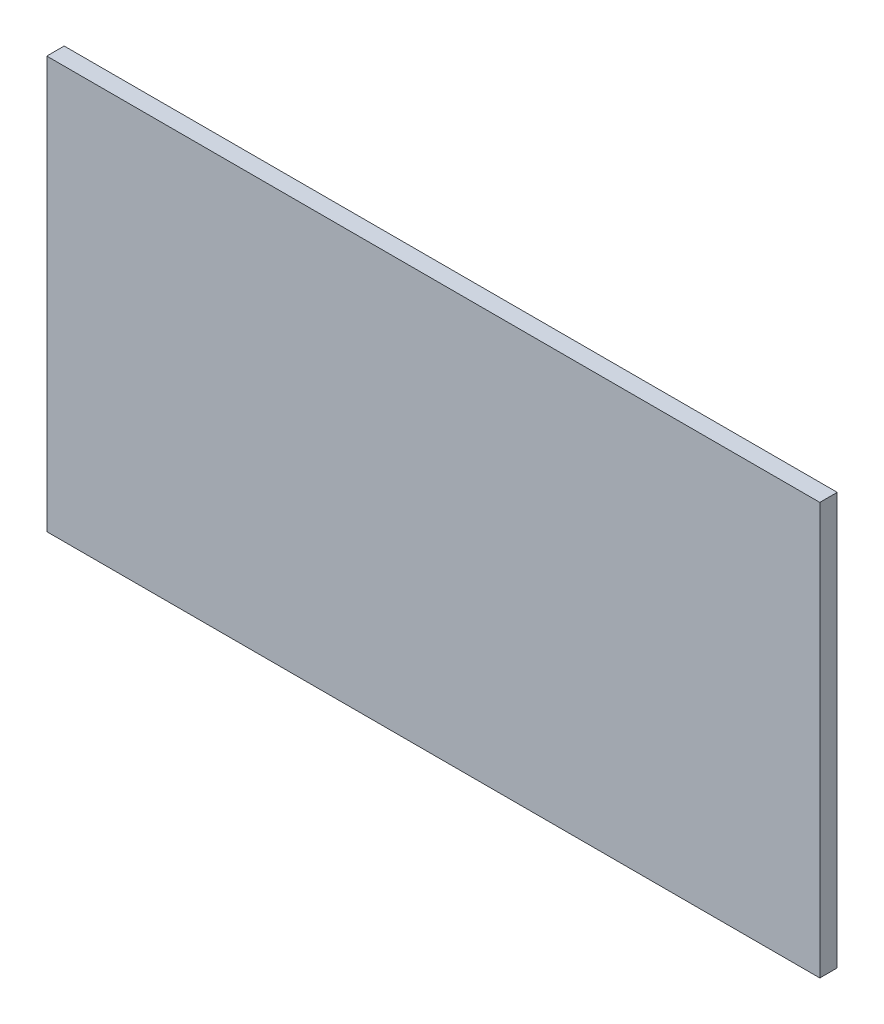
ISO-10303-21;
HEADER;
FILE_DESCRIPTION(('STEP AP214'),'2;1');
FILE_NAME('part.step','',(''),(''),'','','');
FILE_SCHEMA(('AUTOMOTIVE_DESIGN { 1 0 10303 214 1 1 1 1 }'));
ENDSEC;
DATA;
#1=APPLICATION_CONTEXT('core data for automotive mechanical design processes');
#2=APPLICATION_PROTOCOL_DEFINITION('international standard','automotive_design',2000,#1);
#3=PRODUCT_CONTEXT('',#1,'mechanical');
#4=PRODUCT('Part','Part','',(#3));
#5=PRODUCT_RELATED_PRODUCT_CATEGORY('part','',(#4));
#6=PRODUCT_DEFINITION_FORMATION('','',#4);
#7=PRODUCT_DEFINITION_CONTEXT('part definition',#1,'design');
#8=PRODUCT_DEFINITION('design','',#6,#7);
#9=PRODUCT_DEFINITION_SHAPE('','',#8);
#10=(LENGTH_UNIT() NAMED_UNIT(*) SI_UNIT(.MILLI.,.METRE.));
#11=(NAMED_UNIT(*) PLANE_ANGLE_UNIT() SI_UNIT($,.RADIAN.));
#12=(NAMED_UNIT(*) SI_UNIT($,.STERADIAN.) SOLID_ANGLE_UNIT());
#13=UNCERTAINTY_MEASURE_WITH_UNIT(LENGTH_MEASURE(1.E-05),#10,'distance_accuracy_value','');
#14=(GEOMETRIC_REPRESENTATION_CONTEXT(3) GLOBAL_UNCERTAINTY_ASSIGNED_CONTEXT((#13)) GLOBAL_UNIT_ASSIGNED_CONTEXT((#10,
#11,#12)) REPRESENTATION_CONTEXT('',''));
#15=CARTESIAN_POINT('',(0.,0.,0.));
#16=DIRECTION('',(0.,0.,1.));
#17=DIRECTION('',(1.,0.,0.));
#18=AXIS2_PLACEMENT_3D('',#15,#16,#17);
#19=CARTESIAN_POINT('',(-57.8962890430608,16.3830794366839,1.));
#20=DIRECTION('',(1.,0.,0.));
#21=DIRECTION('',(0.,1.,0.));
#22=AXIS2_PLACEMENT_3D('',#19,#20,#21);
#23=PLANE('',#22);
#24=DIRECTION('',(0.,-1.,0.));
#25=VECTOR('',#24,1.);
#26=CARTESIAN_POINT('',(-57.8962890430608,16.3830794366839,0.));
#27=LINE('',#26,#25);
#28=CARTESIAN_POINT('',(-57.8962890430608,16.3830794366839,0.));
#29=VERTEX_POINT('',#28);
#30=CARTESIAN_POINT('',(-57.8962890430608,-7.27124352331605,0.));
#31=VERTEX_POINT('',#30);
#32=EDGE_CURVE('E96',#29,#31,#27,.T.);
#33=ORIENTED_EDGE('',*,*,#32,.T.);
#34=DIRECTION('',(0.,0.,-1.));
#35=VECTOR('',#34,1.);
#36=CARTESIAN_POINT('',(-57.8962890430608,-7.27124352331605,1.));
#37=LINE('',#36,#35);
#38=CARTESIAN_POINT('',(-57.8962890430608,-7.27124352331605,1.));
#39=VERTEX_POINT('',#38);
#40=EDGE_CURVE('E11',#39,#31,#37,.T.);
#41=ORIENTED_EDGE('',*,*,#40,.F.);
#42=DIRECTION('',(0.,-1.,0.));
#43=VECTOR('',#42,1.);
#44=CARTESIAN_POINT('',(-57.8962890430608,16.3830794366839,1.));
#45=LINE('',#44,#43);
#46=CARTESIAN_POINT('',(-57.8962890430608,16.3830794366839,1.));
#47=VERTEX_POINT('',#46);
#48=EDGE_CURVE('E84',#47,#39,#45,.T.);
#49=ORIENTED_EDGE('',*,*,#48,.F.);
#50=DIRECTION('',(0.,0.,-1.));
#51=VECTOR('',#50,1.);
#52=CARTESIAN_POINT('',(-57.8962890430608,16.3830794366839,1.));
#53=LINE('',#52,#51);
#54=EDGE_CURVE('E92',#47,#29,#53,.T.);
#55=ORIENTED_EDGE('',*,*,#54,.T.);
#56=EDGE_LOOP('',(#33,#41,#49,#55));
#57=FACE_BOUND('',#56,.T.);
#58=ADVANCED_FACE('F33',(#57),#23,.F.);
#59=CARTESIAN_POINT('',(-57.8962890430608,-7.27124352331605,1.));
#60=DIRECTION('',(0.,1.,0.));
#61=DIRECTION('',(0.,0.,1.));
#62=AXIS2_PLACEMENT_3D('',#59,#60,#61);
#63=PLANE('',#62);
#64=DIRECTION('',(1.,0.,0.));
#65=VECTOR('',#64,1.);
#66=CARTESIAN_POINT('',(-57.8962890430608,-7.27124352331605,0.));
#67=LINE('',#66,#65);
#68=CARTESIAN_POINT('',(-13.5012238530608,-7.27124352331605,0.));
#69=VERTEX_POINT('',#68);
#70=EDGE_CURVE('E88',#31,#69,#67,.T.);
#71=ORIENTED_EDGE('',*,*,#70,.T.);
#72=DIRECTION('',(0.,0.,-1.));
#73=VECTOR('',#72,1.);
#74=CARTESIAN_POINT('',(-13.5012238530608,-7.27124352331605,1.));
#75=LINE('',#74,#73);
#76=CARTESIAN_POINT('',(-13.5012238530608,-7.27124352331605,1.));
#77=VERTEX_POINT('',#76);
#78=EDGE_CURVE('E41',#77,#69,#75,.T.);
#79=ORIENTED_EDGE('',*,*,#78,.F.);
#80=DIRECTION('',(1.,0.,0.));
#81=VECTOR('',#80,1.);
#82=CARTESIAN_POINT('',(-57.8962890430608,-7.27124352331605,1.));
#83=LINE('',#82,#81);
#84=EDGE_CURVE('E79',#39,#77,#83,.T.);
#85=ORIENTED_EDGE('',*,*,#84,.F.);
#86=ORIENTED_EDGE('',*,*,#40,.T.);
#87=EDGE_LOOP('',(#71,#79,#85,#86));
#88=FACE_BOUND('',#87,.T.);
#89=ADVANCED_FACE('F87',(#88),#63,.F.);
#90=CARTESIAN_POINT('',(-13.5012238530608,16.3830794366839,1.));
#91=DIRECTION('',(-1.,0.,0.));
#92=DIRECTION('',(0.,-1.,0.));
#93=AXIS2_PLACEMENT_3D('',#90,#91,#92);
#94=PLANE('',#93);
#95=DIRECTION('',(0.,1.,0.));
#96=VECTOR('',#95,1.);
#97=CARTESIAN_POINT('',(-13.5012238530608,16.3830794366839,0.));
#98=LINE('',#97,#96);
#99=CARTESIAN_POINT('',(-13.5012238530608,16.3830794366839,0.));
#100=VERTEX_POINT('',#99);
#101=EDGE_CURVE('E66',#69,#100,#98,.T.);
#102=ORIENTED_EDGE('',*,*,#101,.T.);
#103=DIRECTION('',(0.,0.,-1.));
#104=VECTOR('',#103,1.);
#105=CARTESIAN_POINT('',(-13.5012238530608,16.3830794366839,1.));
#106=LINE('',#105,#104);
#107=CARTESIAN_POINT('',(-13.5012238530608,16.3830794366839,1.));
#108=VERTEX_POINT('',#107);
#109=EDGE_CURVE('E89',#108,#100,#106,.T.);
#110=ORIENTED_EDGE('',*,*,#109,.F.);
#111=DIRECTION('',(0.,1.,0.));
#112=VECTOR('',#111,1.);
#113=CARTESIAN_POINT('',(-13.5012238530608,16.3830794366839,1.));
#114=LINE('',#113,#112);
#115=EDGE_CURVE('E82',#77,#108,#114,.T.);
#116=ORIENTED_EDGE('',*,*,#115,.F.);
#117=ORIENTED_EDGE('',*,*,#78,.T.);
#118=EDGE_LOOP('',(#102,#110,#116,#117));
#119=FACE_BOUND('',#118,.T.);
#120=ADVANCED_FACE('F90',(#119),#94,.F.);
#121=CARTESIAN_POINT('',(-57.8962890430608,16.3830794366839,1.));
#122=DIRECTION('',(0.,-1.,0.));
#123=DIRECTION('',(0.,0.,-1.));
#124=AXIS2_PLACEMENT_3D('',#121,#122,#123);
#125=PLANE('',#124);
#126=DIRECTION('',(-1.,0.,0.));
#127=VECTOR('',#126,1.);
#128=CARTESIAN_POINT('',(-57.8962890430608,16.3830794366839,0.));
#129=LINE('',#128,#127);
#130=EDGE_CURVE('E72',#100,#29,#129,.T.);
#131=ORIENTED_EDGE('',*,*,#130,.T.);
#132=ORIENTED_EDGE('',*,*,#54,.F.);
#133=DIRECTION('',(-1.,0.,0.));
#134=VECTOR('',#133,1.);
#135=CARTESIAN_POINT('',(-57.8962890430608,16.3830794366839,1.));
#136=LINE('',#135,#134);
#137=EDGE_CURVE('E49',#108,#47,#136,.T.);
#138=ORIENTED_EDGE('',*,*,#137,.F.);
#139=ORIENTED_EDGE('',*,*,#109,.T.);
#140=EDGE_LOOP('',(#131,#132,#138,#139));
#141=FACE_BOUND('',#140,.T.);
#142=ADVANCED_FACE('F103',(#141),#125,.F.);
#143=CARTESIAN_POINT('',(0.,0.,1.));
#144=DIRECTION('',(0.,0.,1.));
#145=DIRECTION('',(1.,0.,0.));
#146=AXIS2_PLACEMENT_3D('',#143,#144,#145);
#147=PLANE('',#146);
#148=ORIENTED_EDGE('',*,*,#48,.T.);
#149=ORIENTED_EDGE('',*,*,#84,.T.);
#150=ORIENTED_EDGE('',*,*,#115,.T.);
#151=ORIENTED_EDGE('',*,*,#137,.T.);
#152=EDGE_LOOP('',(#148,#149,#150,#151));
#153=FACE_BOUND('',#152,.T.);
#154=ADVANCED_FACE('F80',(#153),#147,.T.);
#155=CARTESIAN_POINT('',(0.,0.,0.));
#156=DIRECTION('',(0.,0.,1.));
#157=DIRECTION('',(1.,0.,0.));
#158=AXIS2_PLACEMENT_3D('',#155,#156,#157);
#159=PLANE('',#158);
#160=ORIENTED_EDGE('',*,*,#32,.F.);
#161=ORIENTED_EDGE('',*,*,#130,.F.);
#162=ORIENTED_EDGE('',*,*,#101,.F.);
#163=ORIENTED_EDGE('',*,*,#70,.F.);
#164=EDGE_LOOP('',(#160,#161,#162,#163));
#165=FACE_BOUND('',#164,.T.);
#166=ADVANCED_FACE('F106',(#165),#159,.F.);
#167=CLOSED_SHELL('',(#58,#89,#120,#142,#154,#166));
#168=MANIFOLD_SOLID_BREP('B2',#167);
#169=ADVANCED_BREP_SHAPE_REPRESENTATION('',(#18,#168),#14);
#170=SHAPE_DEFINITION_REPRESENTATION(#9,#169);
ENDSEC;
END-ISO-10303-21;
